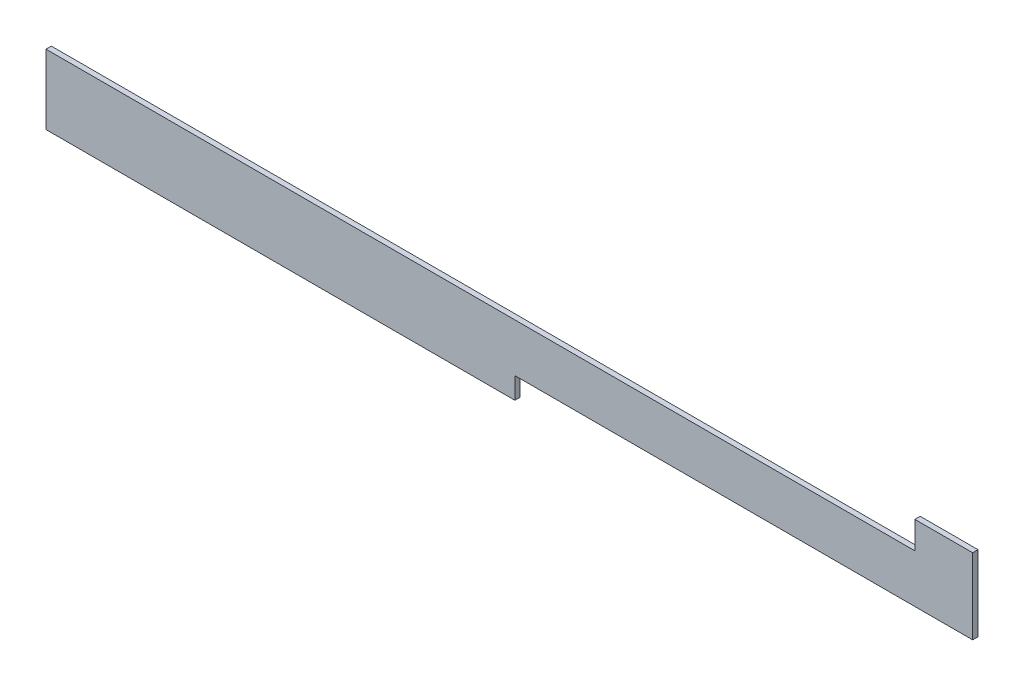
ISO-10303-21;
HEADER;
FILE_DESCRIPTION(('STEP AP214'),'2;1');
FILE_NAME('part.step','',(''),(''),'','','');
FILE_SCHEMA(('AUTOMOTIVE_DESIGN { 1 0 10303 214 1 1 1 1 }'));
ENDSEC;
DATA;
#1=APPLICATION_CONTEXT('core data for automotive mechanical design processes');
#2=APPLICATION_PROTOCOL_DEFINITION('international standard','automotive_design',2000,#1);
#3=PRODUCT_CONTEXT('',#1,'mechanical');
#4=PRODUCT('Part','Part','',(#3));
#5=PRODUCT_RELATED_PRODUCT_CATEGORY('part','',(#4));
#6=PRODUCT_DEFINITION_FORMATION('','',#4);
#7=PRODUCT_DEFINITION_CONTEXT('part definition',#1,'design');
#8=PRODUCT_DEFINITION('design','',#6,#7);
#9=PRODUCT_DEFINITION_SHAPE('','',#8);
#10=(LENGTH_UNIT() NAMED_UNIT(*) SI_UNIT(.MILLI.,.METRE.));
#11=(NAMED_UNIT(*) PLANE_ANGLE_UNIT() SI_UNIT($,.RADIAN.));
#12=(NAMED_UNIT(*) SI_UNIT($,.STERADIAN.) SOLID_ANGLE_UNIT());
#13=UNCERTAINTY_MEASURE_WITH_UNIT(LENGTH_MEASURE(1.E-05),#10,'distance_accuracy_value','');
#14=(GEOMETRIC_REPRESENTATION_CONTEXT(3) GLOBAL_UNCERTAINTY_ASSIGNED_CONTEXT((#13)) GLOBAL_UNIT_ASSIGNED_CONTEXT((#10,
#11,#12)) REPRESENTATION_CONTEXT('',''));
#15=CARTESIAN_POINT('',(0.,0.,0.));
#16=DIRECTION('',(0.,0.,1.));
#17=DIRECTION('',(1.,0.,0.));
#18=AXIS2_PLACEMENT_3D('',#15,#16,#17);
#19=CARTESIAN_POINT('',(0.,-14.351,3.175));
#20=DIRECTION('',(0.,-1.,0.));
#21=DIRECTION('',(1.,0.,0.));
#22=AXIS2_PLACEMENT_3D('',#19,#20,#21);
#23=PLANE('',#22);
#24=DIRECTION('',(-1.,0.,0.));
#25=VECTOR('',#24,1.);
#26=CARTESIAN_POINT('',(0.,-14.351,0.));
#27=LINE('',#26,#25);
#28=CARTESIAN_POINT('',(275.50364,-14.351,0.));
#29=VERTEX_POINT('',#28);
#30=CARTESIAN_POINT('',(3.302,-14.351,0.));
#31=VERTEX_POINT('',#30);
#32=EDGE_CURVE('E145',#29,#31,#27,.T.);
#33=ORIENTED_EDGE('',*,*,#32,.F.);
#34=DIRECTION('',(0.,0.,-1.));
#35=VECTOR('',#34,1.);
#36=CARTESIAN_POINT('',(275.50364,-14.351,3.175));
#37=LINE('',#36,#35);
#38=CARTESIAN_POINT('',(275.50364,-14.351,3.175));
#39=VERTEX_POINT('',#38);
#40=EDGE_CURVE('E11',#39,#29,#37,.T.);
#41=ORIENTED_EDGE('',*,*,#40,.F.);
#42=DIRECTION('',(-1.,0.,0.));
#43=VECTOR('',#42,1.);
#44=CARTESIAN_POINT('',(0.,-14.351,3.175));
#45=LINE('',#44,#43);
#46=CARTESIAN_POINT('',(3.302,-14.351,3.175));
#47=VERTEX_POINT('',#46);
#48=EDGE_CURVE('E170',#39,#47,#45,.T.);
#49=ORIENTED_EDGE('',*,*,#48,.T.);
#50=DIRECTION('',(0.,0.,-1.));
#51=VECTOR('',#50,1.);
#52=CARTESIAN_POINT('',(3.302,-14.351,3.175));
#53=LINE('',#52,#51);
#54=EDGE_CURVE('E64',#47,#31,#53,.T.);
#55=ORIENTED_EDGE('',*,*,#54,.T.);
#56=EDGE_LOOP('',(#33,#41,#49,#55));
#57=FACE_BOUND('',#56,.T.);
#58=ADVANCED_FACE('F47',(#57),#23,.T.);
#59=CARTESIAN_POINT('',(275.50364,0.,3.175));
#60=DIRECTION('',(-1.,0.,0.));
#61=DIRECTION('',(0.,0.,1.));
#62=AXIS2_PLACEMENT_3D('',#59,#60,#61);
#63=PLANE('',#62);
#64=DIRECTION('',(0.,1.,0.));
#65=VECTOR('',#64,1.);
#66=CARTESIAN_POINT('',(275.50364,0.,0.));
#67=LINE('',#66,#65);
#68=CARTESIAN_POINT('',(275.50364,30.5435,0.));
#69=VERTEX_POINT('',#68);
#70=EDGE_CURVE('E148',#29,#69,#67,.T.);
#71=ORIENTED_EDGE('',*,*,#70,.T.);
#72=DIRECTION('',(0.,0.,-1.));
#73=VECTOR('',#72,1.);
#74=CARTESIAN_POINT('',(275.50364,30.5435,3.175));
#75=LINE('',#74,#73);
#76=CARTESIAN_POINT('',(275.50364,30.5435,3.175));
#77=VERTEX_POINT('',#76);
#78=EDGE_CURVE('E56',#77,#69,#75,.T.);
#79=ORIENTED_EDGE('',*,*,#78,.F.);
#80=DIRECTION('',(0.,1.,0.));
#81=VECTOR('',#80,1.);
#82=CARTESIAN_POINT('',(275.50364,0.,3.175));
#83=LINE('',#82,#81);
#84=EDGE_CURVE('E212',#39,#77,#83,.T.);
#85=ORIENTED_EDGE('',*,*,#84,.F.);
#86=ORIENTED_EDGE('',*,*,#40,.T.);
#87=EDGE_LOOP('',(#71,#79,#85,#86));
#88=FACE_BOUND('',#87,.T.);
#89=ADVANCED_FACE('F227',(#88),#63,.F.);
#90=CARTESIAN_POINT('',(0.,30.5435,3.175));
#91=DIRECTION('',(0.,-1.,0.));
#92=DIRECTION('',(1.,0.,0.));
#93=AXIS2_PLACEMENT_3D('',#90,#91,#92);
#94=PLANE('',#93);
#95=DIRECTION('',(-1.,0.,0.));
#96=VECTOR('',#95,1.);
#97=CARTESIAN_POINT('',(0.,30.5435,0.));
#98=LINE('',#97,#96);
#99=CARTESIAN_POINT('',(241.1095,30.5435,0.));
#100=VERTEX_POINT('',#99);
#101=EDGE_CURVE('E151',#69,#100,#98,.T.);
#102=ORIENTED_EDGE('',*,*,#101,.T.);
#103=DIRECTION('',(0.,0.,-1.));
#104=VECTOR('',#103,1.);
#105=CARTESIAN_POINT('',(241.1095,30.5435,3.175));
#106=LINE('',#105,#104);
#107=CARTESIAN_POINT('',(241.1095,30.5435,3.175));
#108=VERTEX_POINT('',#107);
#109=EDGE_CURVE('E181',#108,#100,#106,.T.);
#110=ORIENTED_EDGE('',*,*,#109,.F.);
#111=DIRECTION('',(-1.,0.,0.));
#112=VECTOR('',#111,1.);
#113=CARTESIAN_POINT('',(0.,30.5435,3.175));
#114=LINE('',#113,#112);
#115=EDGE_CURVE('E192',#77,#108,#114,.T.);
#116=ORIENTED_EDGE('',*,*,#115,.F.);
#117=ORIENTED_EDGE('',*,*,#78,.T.);
#118=EDGE_LOOP('',(#102,#110,#116,#117));
#119=FACE_BOUND('',#118,.T.);
#120=ADVANCED_FACE('F190',(#119),#94,.F.);
#121=CARTESIAN_POINT('',(241.1095,0.,3.175));
#122=DIRECTION('',(1.,0.,0.));
#123=DIRECTION('',(0.,0.,-1.));
#124=AXIS2_PLACEMENT_3D('',#121,#122,#123);
#125=PLANE('',#124);
#126=DIRECTION('',(0.,-1.,0.));
#127=VECTOR('',#126,1.);
#128=CARTESIAN_POINT('',(241.1095,0.,0.));
#129=LINE('',#128,#127);
#130=CARTESIAN_POINT('',(241.1095,14.351,0.));
#131=VERTEX_POINT('',#130);
#132=EDGE_CURVE('E154',#100,#131,#129,.T.);
#133=ORIENTED_EDGE('',*,*,#132,.T.);
#134=DIRECTION('',(0.,0.,-1.));
#135=VECTOR('',#134,1.);
#136=CARTESIAN_POINT('',(241.1095,14.351,3.175));
#137=LINE('',#136,#135);
#138=CARTESIAN_POINT('',(241.1095,14.351,3.175));
#139=VERTEX_POINT('',#138);
#140=EDGE_CURVE('E177',#139,#131,#137,.T.);
#141=ORIENTED_EDGE('',*,*,#140,.F.);
#142=DIRECTION('',(0.,-1.,0.));
#143=VECTOR('',#142,1.);
#144=CARTESIAN_POINT('',(241.1095,0.,3.175));
#145=LINE('',#144,#143);
#146=EDGE_CURVE('E206',#108,#139,#145,.T.);
#147=ORIENTED_EDGE('',*,*,#146,.F.);
#148=ORIENTED_EDGE('',*,*,#109,.T.);
#149=EDGE_LOOP('',(#133,#141,#147,#148));
#150=FACE_BOUND('',#149,.T.);
#151=ADVANCED_FACE('F201',(#150),#125,.F.);
#152=CARTESIAN_POINT('',(0.,14.351,3.175));
#153=DIRECTION('',(0.,-1.,0.));
#154=DIRECTION('',(1.,0.,0.));
#155=AXIS2_PLACEMENT_3D('',#152,#153,#154);
#156=PLANE('',#155);
#157=DIRECTION('',(-1.,0.,0.));
#158=VECTOR('',#157,1.);
#159=CARTESIAN_POINT('',(0.,14.351,0.));
#160=LINE('',#159,#158);
#161=CARTESIAN_POINT('',(-275.50364,14.351,0.));
#162=VERTEX_POINT('',#161);
#163=EDGE_CURVE('E157',#131,#162,#160,.T.);
#164=ORIENTED_EDGE('',*,*,#163,.T.);
#165=DIRECTION('',(0.,0.,-1.));
#166=VECTOR('',#165,1.);
#167=CARTESIAN_POINT('',(-275.50364,14.351,3.175));
#168=LINE('',#167,#166);
#169=CARTESIAN_POINT('',(-275.50364,14.351,3.175));
#170=VERTEX_POINT('',#169);
#171=EDGE_CURVE('E124',#170,#162,#168,.T.);
#172=ORIENTED_EDGE('',*,*,#171,.F.);
#173=DIRECTION('',(-1.,0.,0.));
#174=VECTOR('',#173,1.);
#175=CARTESIAN_POINT('',(0.,14.351,3.175));
#176=LINE('',#175,#174);
#177=EDGE_CURVE('E133',#139,#170,#176,.T.);
#178=ORIENTED_EDGE('',*,*,#177,.F.);
#179=ORIENTED_EDGE('',*,*,#140,.T.);
#180=EDGE_LOOP('',(#164,#172,#178,#179));
#181=FACE_BOUND('',#180,.T.);
#182=ADVANCED_FACE('F204',(#181),#156,.F.);
#183=CARTESIAN_POINT('',(-275.50364,0.,3.175));
#184=DIRECTION('',(-1.,0.,0.));
#185=DIRECTION('',(0.,0.,1.));
#186=AXIS2_PLACEMENT_3D('',#183,#184,#185);
#187=PLANE('',#186);
#188=DIRECTION('',(0.,1.,0.));
#189=VECTOR('',#188,1.);
#190=CARTESIAN_POINT('',(-275.50364,0.,0.));
#191=LINE('',#190,#189);
#192=CARTESIAN_POINT('',(-275.50364,-27.051,0.));
#193=VERTEX_POINT('',#192);
#194=EDGE_CURVE('E119',#193,#162,#191,.T.);
#195=ORIENTED_EDGE('',*,*,#194,.F.);
#196=DIRECTION('',(0.,0.,-1.));
#197=VECTOR('',#196,1.);
#198=CARTESIAN_POINT('',(-275.50364,-27.051,3.175));
#199=LINE('',#198,#197);
#200=CARTESIAN_POINT('',(-275.50364,-27.051,3.175));
#201=VERTEX_POINT('',#200);
#202=EDGE_CURVE('E114',#201,#193,#199,.T.);
#203=ORIENTED_EDGE('',*,*,#202,.F.);
#204=DIRECTION('',(0.,1.,0.));
#205=VECTOR('',#204,1.);
#206=CARTESIAN_POINT('',(-275.50364,0.,3.175));
#207=LINE('',#206,#205);
#208=EDGE_CURVE('E117',#201,#170,#207,.T.);
#209=ORIENTED_EDGE('',*,*,#208,.T.);
#210=ORIENTED_EDGE('',*,*,#171,.T.);
#211=EDGE_LOOP('',(#195,#203,#209,#210));
#212=FACE_BOUND('',#211,.T.);
#213=ADVANCED_FACE('F116',(#212),#187,.T.);
#214=CARTESIAN_POINT('',(0.,-27.051,3.175));
#215=DIRECTION('',(0.,-1.,0.));
#216=DIRECTION('',(1.,0.,0.));
#217=AXIS2_PLACEMENT_3D('',#214,#215,#216);
#218=PLANE('',#217);
#219=DIRECTION('',(-1.,0.,0.));
#220=VECTOR('',#219,1.);
#221=CARTESIAN_POINT('',(0.,-27.051,0.));
#222=LINE('',#221,#220);
#223=CARTESIAN_POINT('',(3.30199999999998,-27.051,0.));
#224=VERTEX_POINT('',#223);
#225=EDGE_CURVE('E163',#224,#193,#222,.T.);
#226=ORIENTED_EDGE('',*,*,#225,.F.);
#227=DIRECTION('',(0.,0.,-1.));
#228=VECTOR('',#227,1.);
#229=CARTESIAN_POINT('',(3.30199999999998,-27.051,3.175));
#230=LINE('',#229,#228);
#231=CARTESIAN_POINT('',(3.30199999999998,-27.051,3.175));
#232=VERTEX_POINT('',#231);
#233=EDGE_CURVE('E89',#232,#224,#230,.T.);
#234=ORIENTED_EDGE('',*,*,#233,.F.);
#235=DIRECTION('',(-1.,0.,0.));
#236=VECTOR('',#235,1.);
#237=CARTESIAN_POINT('',(0.,-27.051,3.175));
#238=LINE('',#237,#236);
#239=EDGE_CURVE('E131',#232,#201,#238,.T.);
#240=ORIENTED_EDGE('',*,*,#239,.T.);
#241=ORIENTED_EDGE('',*,*,#202,.T.);
#242=EDGE_LOOP('',(#226,#234,#240,#241));
#243=FACE_BOUND('',#242,.T.);
#244=ADVANCED_FACE('F137',(#243),#218,.T.);
#245=CARTESIAN_POINT('',(3.30200000000003,0.,3.175));
#246=DIRECTION('',(1.,0.,0.));
#247=DIRECTION('',(0.,1.,0.));
#248=AXIS2_PLACEMENT_3D('',#245,#246,#247);
#249=PLANE('',#248);
#250=DIRECTION('',(0.,-1.,0.));
#251=VECTOR('',#250,1.);
#252=CARTESIAN_POINT('',(3.30200000000003,0.,0.));
#253=LINE('',#252,#251);
#254=EDGE_CURVE('E166',#31,#224,#253,.T.);
#255=ORIENTED_EDGE('',*,*,#254,.F.);
#256=ORIENTED_EDGE('',*,*,#54,.F.);
#257=DIRECTION('',(0.,-1.,0.));
#258=VECTOR('',#257,1.);
#259=CARTESIAN_POINT('',(3.30200000000003,0.,3.175));
#260=LINE('',#259,#258);
#261=EDGE_CURVE('E139',#47,#232,#260,.T.);
#262=ORIENTED_EDGE('',*,*,#261,.T.);
#263=ORIENTED_EDGE('',*,*,#233,.T.);
#264=EDGE_LOOP('',(#255,#256,#262,#263));
#265=FACE_BOUND('',#264,.T.);
#266=ADVANCED_FACE('F216',(#265),#249,.T.);
#267=CARTESIAN_POINT('',(0.,0.,3.175));
#268=DIRECTION('',(0.,0.,1.));
#269=DIRECTION('',(1.,0.,0.));
#270=AXIS2_PLACEMENT_3D('',#267,#268,#269);
#271=PLANE('',#270);
#272=ORIENTED_EDGE('',*,*,#48,.F.);
#273=ORIENTED_EDGE('',*,*,#84,.T.);
#274=ORIENTED_EDGE('',*,*,#115,.T.);
#275=ORIENTED_EDGE('',*,*,#146,.T.);
#276=ORIENTED_EDGE('',*,*,#177,.T.);
#277=ORIENTED_EDGE('',*,*,#208,.F.);
#278=ORIENTED_EDGE('',*,*,#239,.F.);
#279=ORIENTED_EDGE('',*,*,#261,.F.);
#280=EDGE_LOOP('',(#272,#273,#274,#275,#276,#277,#278,#279));
#281=FACE_BOUND('',#280,.T.);
#282=ADVANCED_FACE('F129',(#281),#271,.T.);
#283=CARTESIAN_POINT('',(0.,0.,0.));
#284=DIRECTION('',(0.,0.,1.));
#285=DIRECTION('',(1.,0.,0.));
#286=AXIS2_PLACEMENT_3D('',#283,#284,#285);
#287=PLANE('',#286);
#288=ORIENTED_EDGE('',*,*,#32,.T.);
#289=ORIENTED_EDGE('',*,*,#254,.T.);
#290=ORIENTED_EDGE('',*,*,#225,.T.);
#291=ORIENTED_EDGE('',*,*,#194,.T.);
#292=ORIENTED_EDGE('',*,*,#163,.F.);
#293=ORIENTED_EDGE('',*,*,#132,.F.);
#294=ORIENTED_EDGE('',*,*,#101,.F.);
#295=ORIENTED_EDGE('',*,*,#70,.F.);
#296=EDGE_LOOP('',(#288,#289,#290,#291,#292,#293,#294,#295));
#297=FACE_BOUND('',#296,.T.);
#298=ADVANCED_FACE('F197',(#297),#287,.F.);
#299=CLOSED_SHELL('',(#58,#89,#120,#151,#182,#213,#244,#266,#282,#298));
#300=MANIFOLD_SOLID_BREP('B2',#299);
#301=ADVANCED_BREP_SHAPE_REPRESENTATION('',(#18,#300),#14);
#302=SHAPE_DEFINITION_REPRESENTATION(#9,#301);
ENDSEC;
END-ISO-10303-21;
